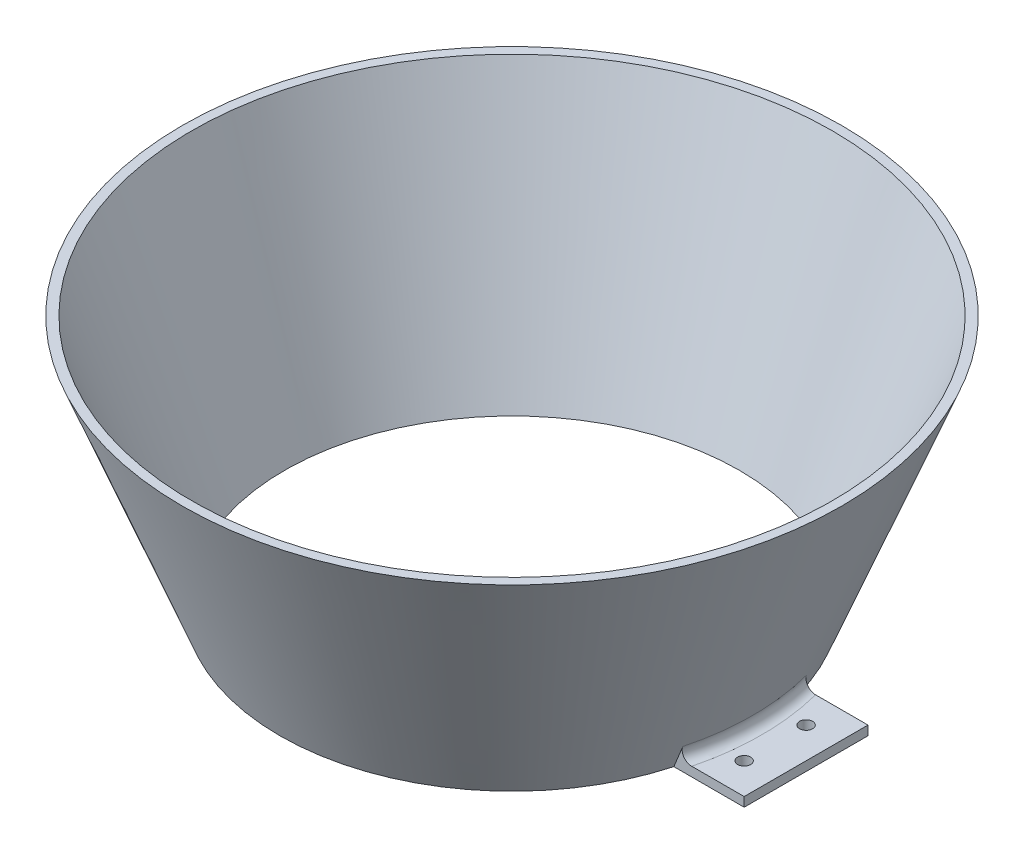
ISO-10303-21;
HEADER;
FILE_DESCRIPTION(('STEP AP214'),'2;1');
FILE_NAME('part.step','',(''),(''),'','','');
FILE_SCHEMA(('AUTOMOTIVE_DESIGN { 1 0 10303 214 1 1 1 1 }'));
ENDSEC;
DATA;
#1=APPLICATION_CONTEXT('core data for automotive mechanical design processes');
#2=APPLICATION_PROTOCOL_DEFINITION('international standard','automotive_design',2000,#1);
#3=PRODUCT_CONTEXT('',#1,'mechanical');
#4=PRODUCT('Part','Part','',(#3));
#5=PRODUCT_RELATED_PRODUCT_CATEGORY('part','',(#4));
#6=PRODUCT_DEFINITION_FORMATION('','',#4);
#7=PRODUCT_DEFINITION_CONTEXT('part definition',#1,'design');
#8=PRODUCT_DEFINITION('design','',#6,#7);
#9=PRODUCT_DEFINITION_SHAPE('','',#8);
#10=(LENGTH_UNIT() NAMED_UNIT(*) SI_UNIT(.MILLI.,.METRE.));
#11=(NAMED_UNIT(*) PLANE_ANGLE_UNIT() SI_UNIT($,.RADIAN.));
#12=(NAMED_UNIT(*) SI_UNIT($,.STERADIAN.) SOLID_ANGLE_UNIT());
#13=UNCERTAINTY_MEASURE_WITH_UNIT(LENGTH_MEASURE(1.E-05),#10,'distance_accuracy_value','');
#14=(GEOMETRIC_REPRESENTATION_CONTEXT(3) GLOBAL_UNCERTAINTY_ASSIGNED_CONTEXT((#13)) GLOBAL_UNIT_ASSIGNED_CONTEXT((#10,
#11,#12)) REPRESENTATION_CONTEXT('',''));
#15=CARTESIAN_POINT('',(0.,0.,0.));
#16=DIRECTION('',(0.,0.,1.));
#17=DIRECTION('',(1.,0.,0.));
#18=AXIS2_PLACEMENT_3D('',#15,#16,#17);
#19=CARTESIAN_POINT('',(0.,80.,0.));
#20=DIRECTION('',(0.,1.,0.));
#21=DIRECTION('',(0.,0.,1.));
#22=AXIS2_PLACEMENT_3D('',#19,#20,#21);
#23=CONICAL_SURFACE('',#22,103.5,0.358770670270572);
#24=CARTESIAN_POINT('',(0.,0.,0.));
#25=DIRECTION('',(0.,-1.,0.));
#26=DIRECTION('',(0.,0.,-1.));
#27=AXIS2_PLACEMENT_3D('',#24,#25,#26);
#28=CIRCLE('',#27,73.5);
#29=CARTESIAN_POINT('',(0.,0.,-73.5));
#30=VERTEX_POINT('',#29);
#31=EDGE_CURVE('E186',#30,#30,#28,.T.);
#32=ORIENTED_EDGE('',*,*,#31,.T.);
#33=EDGE_LOOP('',(#32));
#34=FACE_BOUND('',#33,.T.);
#35=CARTESIAN_POINT('',(0.,80.,0.));
#36=DIRECTION('',(0.,-1.,0.));
#37=DIRECTION('',(0.,0.,-1.));
#38=AXIS2_PLACEMENT_3D('',#35,#36,#37);
#39=CIRCLE('',#38,103.5);
#40=CARTESIAN_POINT('',(0.,80.,-103.5));
#41=VERTEX_POINT('',#40);
#42=EDGE_CURVE('E176',#41,#41,#39,.T.);
#43=ORIENTED_EDGE('',*,*,#42,.F.);
#44=EDGE_LOOP('',(#43));
#45=FACE_BOUND('',#44,.T.);
#46=ADVANCED_FACE('F39',(#34,#45),#23,.F.);
#47=CARTESIAN_POINT('',(73.5,0.,0.));
#48=DIRECTION('',(0.,-1.,0.));
#49=DIRECTION('',(0.,0.,-1.));
#50=AXIS2_PLACEMENT_3D('',#47,#48,#49);
#51=PLANE('',#50);
#52=CARTESIAN_POINT('',(-85.,0.,10.));
#53=DIRECTION('',(0.,-1.,0.));
#54=DIRECTION('',(0.,0.,1.));
#55=AXIS2_PLACEMENT_3D('',#52,#53,#54);
#56=CIRCLE('',#55,2.1);
#57=CARTESIAN_POINT('',(-85.,0.,12.1));
#58=VERTEX_POINT('',#57);
#59=EDGE_CURVE('E453',#58,#58,#56,.T.);
#60=ORIENTED_EDGE('',*,*,#59,.F.);
#61=EDGE_LOOP('',(#60));
#62=FACE_BOUND('',#61,.T.);
#63=CARTESIAN_POINT('',(-85.,0.,-10.));
#64=DIRECTION('',(0.,-1.,0.));
#65=DIRECTION('',(0.,0.,-1.));
#66=AXIS2_PLACEMENT_3D('',#63,#64,#65);
#67=CIRCLE('',#66,2.1);
#68=CARTESIAN_POINT('',(-85.,0.,-12.1));
#69=VERTEX_POINT('',#68);
#70=EDGE_CURVE('E446',#69,#69,#67,.T.);
#71=ORIENTED_EDGE('',*,*,#70,.F.);
#72=EDGE_LOOP('',(#71));
#73=FACE_BOUND('',#72,.T.);
#74=CARTESIAN_POINT('',(85.,0.,-10.));
#75=DIRECTION('',(0.,-1.,0.));
#76=DIRECTION('',(0.,0.,1.));
#77=AXIS2_PLACEMENT_3D('',#74,#75,#76);
#78=CIRCLE('',#77,2.1);
#79=CARTESIAN_POINT('',(85.,0.,-7.9));
#80=VERTEX_POINT('',#79);
#81=EDGE_CURVE('E451',#80,#80,#78,.T.);
#82=ORIENTED_EDGE('',*,*,#81,.F.);
#83=EDGE_LOOP('',(#82));
#84=FACE_BOUND('',#83,.T.);
#85=CARTESIAN_POINT('',(85.,0.,10.));
#86=DIRECTION('',(0.,-1.,0.));
#87=DIRECTION('',(0.,0.,-1.));
#88=AXIS2_PLACEMENT_3D('',#85,#86,#87);
#89=CIRCLE('',#88,2.1);
#90=CARTESIAN_POINT('',(85.,0.,7.9));
#91=VERTEX_POINT('',#90);
#92=EDGE_CURVE('E464',#91,#91,#89,.T.);
#93=ORIENTED_EDGE('',*,*,#92,.F.);
#94=EDGE_LOOP('',(#93));
#95=FACE_BOUND('',#94,.T.);
#96=CARTESIAN_POINT('',(0.,0.,0.));
#97=DIRECTION('',(0.,-1.,0.));
#98=DIRECTION('',(0.,0.,-1.));
#99=AXIS2_PLACEMENT_3D('',#96,#97,#98);
#100=CIRCLE('',#99,75.);
#101=CARTESIAN_POINT('',(72.2841614740048,0.,20.));
#102=VERTEX_POINT('',#101);
#103=CARTESIAN_POINT('',(-72.2841614740048,0.,20.));
#104=VERTEX_POINT('',#103);
#105=EDGE_CURVE('E184',#102,#104,#100,.T.);
#106=ORIENTED_EDGE('',*,*,#105,.T.);
#107=DIRECTION('',(-1.,0.,0.));
#108=VECTOR('',#107,1.);
#109=CARTESIAN_POINT('',(-95.,0.,20.));
#110=LINE('',#109,#108);
#111=CARTESIAN_POINT('',(-95.,0.,20.));
#112=VERTEX_POINT('',#111);
#113=EDGE_CURVE('E142',#104,#112,#110,.T.);
#114=ORIENTED_EDGE('',*,*,#113,.T.);
#115=DIRECTION('',(0.,0.,-1.));
#116=VECTOR('',#115,1.);
#117=CARTESIAN_POINT('',(-95.,0.,-20.));
#118=LINE('',#117,#116);
#119=CARTESIAN_POINT('',(-95.,0.,-20.));
#120=VERTEX_POINT('',#119);
#121=EDGE_CURVE('E125',#112,#120,#118,.T.);
#122=ORIENTED_EDGE('',*,*,#121,.T.);
#123=DIRECTION('',(1.,0.,0.));
#124=VECTOR('',#123,1.);
#125=CARTESIAN_POINT('',(-72.2841614740048,0.,-20.));
#126=LINE('',#125,#124);
#127=CARTESIAN_POINT('',(-72.2841614740048,0.,-20.));
#128=VERTEX_POINT('',#127);
#129=EDGE_CURVE('E140',#120,#128,#126,.T.);
#130=ORIENTED_EDGE('',*,*,#129,.T.);
#131=CARTESIAN_POINT('',(72.2841614740048,0.,-20.));
#132=VERTEX_POINT('',#131);
#133=EDGE_CURVE('E183',#128,#132,#100,.T.);
#134=ORIENTED_EDGE('',*,*,#133,.T.);
#135=DIRECTION('',(1.,0.,0.));
#136=VECTOR('',#135,1.);
#137=CARTESIAN_POINT('',(72.2841614740048,0.,-20.));
#138=LINE('',#137,#136);
#139=CARTESIAN_POINT('',(95.,0.,-20.));
#140=VERTEX_POINT('',#139);
#141=EDGE_CURVE('E154',#132,#140,#138,.T.);
#142=ORIENTED_EDGE('',*,*,#141,.T.);
#143=DIRECTION('',(0.,0.,1.));
#144=VECTOR('',#143,1.);
#145=CARTESIAN_POINT('',(95.,0.,-20.));
#146=LINE('',#145,#144);
#147=CARTESIAN_POINT('',(95.,0.,20.));
#148=VERTEX_POINT('',#147);
#149=EDGE_CURVE('E170',#140,#148,#146,.T.);
#150=ORIENTED_EDGE('',*,*,#149,.T.);
#151=DIRECTION('',(-1.,0.,0.));
#152=VECTOR('',#151,1.);
#153=CARTESIAN_POINT('',(95.,0.,20.));
#154=LINE('',#153,#152);
#155=EDGE_CURVE('E161',#148,#102,#154,.T.);
#156=ORIENTED_EDGE('',*,*,#155,.T.);
#157=EDGE_LOOP('',(#106,#114,#122,#130,#134,#142,#150,#156));
#158=FACE_BOUND('',#157,.T.);
#159=ORIENTED_EDGE('',*,*,#31,.F.);
#160=EDGE_LOOP('',(#159));
#161=FACE_BOUND('',#160,.T.);
#162=ADVANCED_FACE('F138',(#62,#73,#84,#95,#158,#161),#51,.T.);
#163=CARTESIAN_POINT('',(0.,0.,0.));
#164=DIRECTION('',(0.,1.,0.));
#165=DIRECTION('',(0.,0.,1.));
#166=AXIS2_PLACEMENT_3D('',#163,#164,#165);
#167=CONICAL_SURFACE('',#166,75.,0.375106861552295);
#168=CARTESIAN_POINT('',(0.,7.09911588745038,0.));
#169=DIRECTION('',(0.,-1.,0.));
#170=DIRECTION('',(0.,0.,-1.));
#171=AXIS2_PLACEMENT_3D('',#168,#169,#170);
#172=CIRCLE('',#171,77.7952768806836);
#173=CARTESIAN_POINT('',(-75.1804835375659,7.09911588745036,-20.));
#174=VERTEX_POINT('',#173);
#175=CARTESIAN_POINT('',(-75.1804835375659,7.09911588745036,20.));
#176=VERTEX_POINT('',#175);
#177=EDGE_CURVE('E280',#174,#176,#172,.F.);
#178=ORIENTED_EDGE('',*,*,#177,.T.);
#179=CARTESIAN_POINT('',(-62.8735450279451,-22.9132818516211,20.));
#180=CARTESIAN_POINT('',(-63.7127937488367,-20.8821258643666,20.));
#181=CARTESIAN_POINT('',(-64.5507361640538,-18.8504306317642,20.));
#182=CARTESIAN_POINT('',(-66.2242674418764,-14.7860717428361,20.));
#183=CARTESIAN_POINT('',(-67.0598563052033,-12.7534080868076,20.));
#184=CARTESIAN_POINT('',(-69.5634793697815,-6.65413394214606,20.));
#185=CARTESIAN_POINT('',(-71.228372614355,-2.58623405557579,20.));
#186=CARTESIAN_POINT('',(-74.5513638136694,5.5523088191067,20.));
#187=CARTESIAN_POINT('',(-76.209461811409,9.62295178967102,20.));
#188=CARTESIAN_POINT('',(-79.5200722531943,17.7665099716478,20.));
#189=CARTESIAN_POINT('',(-81.1725846948848,21.8394251840176,20.));
#190=CARTESIAN_POINT('',(-84.7737062468235,30.7295965504295,20.));
#191=CARTESIAN_POINT('',(-86.7213908472741,35.5472271341166,20.));
#192=CARTESIAN_POINT('',(-90.6114551957085,45.18462992649,20.));
#193=CARTESIAN_POINT('',(-92.5538349428574,50.0044021355132,20.));
#194=CARTESIAN_POINT('',(-96.4342022893878,59.6457183305952,20.));
#195=CARTESIAN_POINT('',(-98.3721898853822,64.4672623180169,20.));
#196=CARTESIAN_POINT('',(-102.24448587917,74.1118275404236,20.));
#197=CARTESIAN_POINT('',(-104.178794276805,78.9348487754721,20.));
#198=CARTESIAN_POINT('',(-108.044328911286,88.5822141473155,20.));
#199=CARTESIAN_POINT('',(-109.975555099171,93.4065583037264,20.));
#200=CARTESIAN_POINT('',(-113.835349673903,103.056309829621,20.));
#201=CARTESIAN_POINT('',(-115.763918060654,107.881717199143,20.));
#202=CARTESIAN_POINT('',(-119.618765536104,117.53343212351,20.));
#203=CARTESIAN_POINT('',(-121.545044630549,122.35973967606,20.));
#204=CARTESIAN_POINT('',(-125.395611655524,132.01314841354,20.));
#205=CARTESIAN_POINT('',(-127.319899586278,136.84024959838,20.));
#206=CARTESIAN_POINT('',(-129.243338789873,141.667688800755,20.));
#207=B_SPLINE_CURVE_WITH_KNOTS('',3,(#179,#180,#181,#182,#183,#184,#185,#186,#187,#188,#189,
#190,#191,#192,#193,#194,#195,#196,#197,#198,#199,#200,#201,#202,#203,#204,#205,#206),
.UNSPECIFIED.,.F.,.F.,(4,2,2,2,2,2,2,2,2,2,2,2,2,4),(0.,6.5931314189348,13.1862608168279,
26.3724994202548,39.5586544554173,52.7448150502635,68.3341458185368,83.9234790406863,
99.5128242811076,115.102170191536,130.691761323693,146.28135302736,161.870905528909,
177.46045627589),.UNSPECIFIED.);
#208=EDGE_CURVE('E273',#104,#176,#207,.T.);
#209=ORIENTED_EDGE('',*,*,#208,.F.);
#210=ORIENTED_EDGE('',*,*,#105,.F.);
#211=CARTESIAN_POINT('',(129.243338789873,141.667688800755,20.));
#212=CARTESIAN_POINT('',(127.319899586278,136.84024959838,20.));
#213=CARTESIAN_POINT('',(125.395611655524,132.01314841354,20.));
#214=CARTESIAN_POINT('',(121.545044630549,122.35973967606,20.));
#215=CARTESIAN_POINT('',(119.618765536104,117.53343212351,20.));
#216=CARTESIAN_POINT('',(115.763918060654,107.881717199143,20.));
#217=CARTESIAN_POINT('',(113.835349673903,103.056309829621,20.));
#218=CARTESIAN_POINT('',(109.975555099171,93.4065583037264,20.));
#219=CARTESIAN_POINT('',(108.044328911286,88.5822141473156,20.));
#220=CARTESIAN_POINT('',(104.178794276805,78.9348487754722,20.));
#221=CARTESIAN_POINT('',(102.24448587917,74.1118275404237,20.));
#222=CARTESIAN_POINT('',(98.3721898853822,64.4672623180169,20.));
#223=CARTESIAN_POINT('',(96.4342022893879,59.6457183305952,20.));
#224=CARTESIAN_POINT('',(92.5538349428574,50.0044021355133,20.));
#225=CARTESIAN_POINT('',(90.6114551957085,45.18462992649,20.));
#226=CARTESIAN_POINT('',(86.7213908472741,35.5472271341166,20.));
#227=CARTESIAN_POINT('',(84.7737062468235,30.7295965504295,20.));
#228=CARTESIAN_POINT('',(81.1725846948848,21.8394251840176,20.));
#229=CARTESIAN_POINT('',(79.5200722531943,17.7665099716478,20.));
#230=CARTESIAN_POINT('',(76.209461811409,9.62295178967102,20.));
#231=CARTESIAN_POINT('',(74.5513638136694,5.55230881910669,20.));
#232=CARTESIAN_POINT('',(71.228372614355,-2.58623405557579,20.));
#233=CARTESIAN_POINT('',(69.5634793697815,-6.65413394214606,20.));
#234=CARTESIAN_POINT('',(67.0598563052033,-12.7534080868076,20.));
#235=CARTESIAN_POINT('',(66.2242674418763,-14.7860717428361,20.));
#236=CARTESIAN_POINT('',(64.5507361640538,-18.8504306317642,20.));
#237=CARTESIAN_POINT('',(63.7127937488367,-20.8821258643667,20.));
#238=CARTESIAN_POINT('',(62.8735450279451,-22.9132818516211,20.));
#239=B_SPLINE_CURVE_WITH_KNOTS('',3,(#211,#212,#213,#214,#215,#216,#217,#218,#219,#220,#221,
#222,#223,#224,#225,#226,#227,#228,#229,#230,#231,#232,#233,#234,#235,#236,#237,#238),
.UNSPECIFIED.,.F.,.F.,(4,2,2,2,2,2,2,2,2,2,2,2,2,4),(0.,15.589550746982,31.1791032485302,
46.7686949521976,62.358286084354,77.9476319947828,93.5369772352041,109.126310457354,
124.715641225627,137.901801820473,151.087956855636,164.274195459063,170.867324856956,
177.46045627589),.UNSPECIFIED.);
#240=CARTESIAN_POINT('',(75.1804835375659,7.09911588745036,20.));
#241=VERTEX_POINT('',#240);
#242=EDGE_CURVE('E196',#241,#102,#239,.T.);
#243=ORIENTED_EDGE('',*,*,#242,.F.);
#244=CARTESIAN_POINT('',(0.,7.09911588745036,0.));
#245=DIRECTION('',(0.,1.,0.));
#246=DIRECTION('',(0.,0.,1.));
#247=AXIS2_PLACEMENT_3D('',#244,#245,#246);
#248=CIRCLE('',#247,77.7952768806836);
#249=CARTESIAN_POINT('',(75.1804835375659,7.09911588745036,-20.));
#250=VERTEX_POINT('',#249);
#251=EDGE_CURVE('E272',#241,#250,#248,.T.);
#252=ORIENTED_EDGE('',*,*,#251,.T.);
#253=CARTESIAN_POINT('',(62.8735450279451,-22.9132818516211,-20.));
#254=CARTESIAN_POINT('',(63.7127937488367,-20.8821258643666,-20.));
#255=CARTESIAN_POINT('',(64.5507361640538,-18.8504306317642,-20.));
#256=CARTESIAN_POINT('',(66.2242674418764,-14.7860717428361,-20.));
#257=CARTESIAN_POINT('',(67.0598563052033,-12.7534080868076,-20.));
#258=CARTESIAN_POINT('',(69.5634793697815,-6.65413394214605,-20.));
#259=CARTESIAN_POINT('',(71.228372614355,-2.58623405557578,-20.));
#260=CARTESIAN_POINT('',(74.5513638136694,5.5523088191067,-20.));
#261=CARTESIAN_POINT('',(76.209461811409,9.62295178967102,-20.));
#262=CARTESIAN_POINT('',(79.5200722531943,17.7665099716478,-20.));
#263=CARTESIAN_POINT('',(81.1725846948848,21.8394251840176,-20.));
#264=CARTESIAN_POINT('',(84.7737062468235,30.7295965504295,-20.));
#265=CARTESIAN_POINT('',(86.7213908472741,35.5472271341166,-20.));
#266=CARTESIAN_POINT('',(90.6114551957085,45.18462992649,-20.));
#267=CARTESIAN_POINT('',(92.5538349428574,50.0044021355133,-20.));
#268=CARTESIAN_POINT('',(96.4342022893879,59.6457183305952,-20.));
#269=CARTESIAN_POINT('',(98.3721898853822,64.4672623180169,-20.));
#270=CARTESIAN_POINT('',(102.24448587917,74.1118275404237,-20.));
#271=CARTESIAN_POINT('',(104.178794276805,78.9348487754722,-20.));
#272=CARTESIAN_POINT('',(108.044328911286,88.5822141473156,-20.));
#273=CARTESIAN_POINT('',(109.975555099171,93.4065583037264,-20.));
#274=CARTESIAN_POINT('',(113.835349673903,103.056309829621,-20.));
#275=CARTESIAN_POINT('',(115.763918060654,107.881717199143,-20.));
#276=CARTESIAN_POINT('',(119.618765536104,117.53343212351,-20.));
#277=CARTESIAN_POINT('',(121.545044630549,122.35973967606,-20.));
#278=CARTESIAN_POINT('',(125.395611655524,132.01314841354,-20.));
#279=CARTESIAN_POINT('',(127.319899586278,136.84024959838,-20.));
#280=CARTESIAN_POINT('',(129.243338789873,141.667688800755,-20.));
#281=B_SPLINE_CURVE_WITH_KNOTS('',3,(#253,#254,#255,#256,#257,#258,#259,#260,#261,#262,#263,
#264,#265,#266,#267,#268,#269,#270,#271,#272,#273,#274,#275,#276,#277,#278,#279,#280),
.UNSPECIFIED.,.F.,.F.,(4,2,2,2,2,2,2,2,2,2,2,2,2,4),(0.,6.5931314189348,13.1862608168279,
26.3724994202548,39.5586544554173,52.7448150502635,68.3341458185368,83.9234790406863,
99.5128242811077,115.102170191537,130.691761323693,146.28135302736,161.870905528909,
177.460456275891),.UNSPECIFIED.);
#282=EDGE_CURVE('E189',#132,#250,#281,.T.);
#283=ORIENTED_EDGE('',*,*,#282,.F.);
#284=ORIENTED_EDGE('',*,*,#133,.F.);
#285=CARTESIAN_POINT('',(-129.243338789873,141.667688800755,-20.));
#286=CARTESIAN_POINT('',(-127.319899586278,136.84024959838,-20.));
#287=CARTESIAN_POINT('',(-125.395611655524,132.01314841354,-20.));
#288=CARTESIAN_POINT('',(-121.545044630549,122.35973967606,-20.));
#289=CARTESIAN_POINT('',(-119.618765536104,117.53343212351,-20.));
#290=CARTESIAN_POINT('',(-115.763918060654,107.881717199143,-20.));
#291=CARTESIAN_POINT('',(-113.835349673903,103.056309829621,-20.));
#292=CARTESIAN_POINT('',(-109.975555099171,93.4065583037264,-20.));
#293=CARTESIAN_POINT('',(-108.044328911286,88.5822141473156,-20.));
#294=CARTESIAN_POINT('',(-104.178794276805,78.9348487754722,-20.));
#295=CARTESIAN_POINT('',(-102.24448587917,74.1118275404237,-20.));
#296=CARTESIAN_POINT('',(-98.3721898853822,64.4672623180169,-20.));
#297=CARTESIAN_POINT('',(-96.4342022893879,59.6457183305952,-20.));
#298=CARTESIAN_POINT('',(-92.5538349428574,50.0044021355133,-20.));
#299=CARTESIAN_POINT('',(-90.6114551957085,45.18462992649,-20.));
#300=CARTESIAN_POINT('',(-86.7213908472741,35.5472271341166,-20.));
#301=CARTESIAN_POINT('',(-84.7737062468235,30.7295965504295,-20.));
#302=CARTESIAN_POINT('',(-81.1725846948848,21.8394251840176,-20.));
#303=CARTESIAN_POINT('',(-79.5200722531943,17.7665099716478,-20.));
#304=CARTESIAN_POINT('',(-76.209461811409,9.62295178967102,-20.));
#305=CARTESIAN_POINT('',(-74.5513638136694,5.5523088191067,-20.));
#306=CARTESIAN_POINT('',(-71.228372614355,-2.58623405557578,-20.));
#307=CARTESIAN_POINT('',(-69.5634793697815,-6.65413394214604,-20.));
#308=CARTESIAN_POINT('',(-67.0598563052033,-12.7534080868076,-20.));
#309=CARTESIAN_POINT('',(-66.2242674418764,-14.7860717428361,-20.));
#310=CARTESIAN_POINT('',(-64.5507361640538,-18.8504306317641,-20.));
#311=CARTESIAN_POINT('',(-63.7127937488367,-20.8821258643666,-20.));
#312=CARTESIAN_POINT('',(-62.8735450279451,-22.9132818516211,-20.));
#313=B_SPLINE_CURVE_WITH_KNOTS('',3,(#285,#286,#287,#288,#289,#290,#291,#292,#293,#294,#295,
#296,#297,#298,#299,#300,#301,#302,#303,#304,#305,#306,#307,#308,#309,#310,#311,#312),
.UNSPECIFIED.,.F.,.F.,(4,2,2,2,2,2,2,2,2,2,2,2,2,4),(0.,15.589550746982,31.1791032485302,
46.7686949521976,62.358286084354,77.9476319947828,93.5369772352041,109.126310457354,
124.715641225627,137.901801820473,151.087956855636,164.274195459063,170.867324856956,
177.46045627589),.UNSPECIFIED.);
#314=EDGE_CURVE('E146',#174,#128,#313,.T.);
#315=ORIENTED_EDGE('',*,*,#314,.F.);
#316=EDGE_LOOP('',(#178,#209,#210,#243,#252,#283,#284,#315));
#317=FACE_BOUND('',#316,.T.);
#318=CARTESIAN_POINT('',(0.,80.,0.));
#319=DIRECTION('',(0.,-1.,0.));
#320=DIRECTION('',(0.,0.,-1.));
#321=AXIS2_PLACEMENT_3D('',#318,#319,#320);
#322=CIRCLE('',#321,106.5);
#323=CARTESIAN_POINT('',(0.,80.,-106.5));
#324=VERTEX_POINT('',#323);
#325=EDGE_CURVE('E180',#324,#324,#322,.T.);
#326=ORIENTED_EDGE('',*,*,#325,.T.);
#327=EDGE_LOOP('',(#326));
#328=FACE_BOUND('',#327,.T.);
#329=ADVANCED_FACE('F203',(#317,#328),#167,.T.);
#330=CARTESIAN_POINT('',(106.5,80.,0.));
#331=DIRECTION('',(0.,1.,0.));
#332=DIRECTION('',(0.,0.,1.));
#333=AXIS2_PLACEMENT_3D('',#330,#331,#332);
#334=PLANE('',#333);
#335=ORIENTED_EDGE('',*,*,#42,.T.);
#336=EDGE_LOOP('',(#335));
#337=FACE_BOUND('',#336,.T.);
#338=ORIENTED_EDGE('',*,*,#325,.F.);
#339=EDGE_LOOP('',(#338));
#340=FACE_BOUND('',#339,.T.);
#341=ADVANCED_FACE('F213',(#337,#340),#334,.T.);
#342=CARTESIAN_POINT('',(95.,3.,20.));
#343=DIRECTION('',(0.,0.,1.));
#344=DIRECTION('',(1.,0.,0.));
#345=AXIS2_PLACEMENT_3D('',#342,#343,#344);
#346=PLANE('',#345);
#347=DIRECTION('',(-1.,0.,0.));
#348=VECTOR('',#347,1.);
#349=CARTESIAN_POINT('',(95.,3.,20.));
#350=LINE('',#349,#348);
#351=CARTESIAN_POINT('',(95.,3.,20.));
#352=VERTEX_POINT('',#351);
#353=CARTESIAN_POINT('',(78.0654428386368,3.,20.));
#354=VERTEX_POINT('',#353);
#355=EDGE_CURVE('E164',#352,#354,#350,.T.);
#356=ORIENTED_EDGE('',*,*,#355,.T.);
#357=CARTESIAN_POINT('',(78.0654428386368,3.,20.));
#358=CARTESIAN_POINT('',(77.9761012386683,2.99999347030844,20.));
#359=CARTESIAN_POINT('',(77.886763153462,3.00374520553447,20.));
#360=CARTESIAN_POINT('',(77.7087134274104,3.0187092604427,20.));
#361=CARTESIAN_POINT('',(77.6200017902027,3.02992162341219,20.));
#362=CARTESIAN_POINT('',(77.4438050319626,3.05975444024869,20.));
#363=CARTESIAN_POINT('',(77.3563201996479,3.0783766086342,20.));
#364=CARTESIAN_POINT('',(77.183250036864,3.1229000078618,20.));
#365=CARTESIAN_POINT('',(77.0976646660982,3.14880108412487,20.));
#366=CARTESIAN_POINT('',(76.8445493320267,3.23727241354867,20.));
#367=CARTESIAN_POINT('',(76.6806328213007,3.31061540077262,20.));
#368=CARTESIAN_POINT('',(76.3678349350593,3.48410273215398,20.));
#369=CARTESIAN_POINT('',(76.2189468071021,3.58423496507224,20.));
#370=CARTESIAN_POINT('',(75.9426914003036,3.80716593911034,20.));
#371=CARTESIAN_POINT('',(75.8150468974244,3.92962018843021,20.));
#372=CARTESIAN_POINT('',(75.5829264899209,4.19486218972995,20.));
#373=CARTESIAN_POINT('',(75.4784515715908,4.33765080688836,20.));
#374=CARTESIAN_POINT('',(75.2992280542332,4.63465559468522,20.));
#375=CARTESIAN_POINT('',(75.2236434198663,4.78836717954048,20.));
#376=CARTESIAN_POINT('',(75.1002903316155,5.10655715571421,20.));
#377=CARTESIAN_POINT('',(75.0525134368709,5.27103226295336,20.));
#378=CARTESIAN_POINT('',(74.9874830370016,5.60073268272364,20.));
#379=CARTESIAN_POINT('',(74.9693524731073,5.76578578438204,20.));
#380=CARTESIAN_POINT('',(74.961508802983,6.09656640303424,20.));
#381=CARTESIAN_POINT('',(74.9717858660002,6.26229366690742,20.));
#382=CARTESIAN_POINT('',(75.0131867786179,6.54131608863272,20.));
#383=CARTESIAN_POINT('',(75.0372948225047,6.65570392384745,20.));
#384=CARTESIAN_POINT('',(75.0989466726731,6.880629411031,20.));
#385=CARTESIAN_POINT('',(75.1364717385033,6.99117219849668,20.));
#386=CARTESIAN_POINT('',(75.1804835375659,7.09911588745036,20.));
#387=B_SPLINE_CURVE_WITH_KNOTS('',3,(#357,#358,#359,#360,#361,#362,#363,#364,#365,#366,#367,
#368,#369,#370,#371,#372,#373,#374,#375,#376,#377,#378,#379,#380,#381,#382,#383,#384,#385,#386),
.UNSPECIFIED.,.F.,.F.,(4,2,2,2,2,2,2,2,2,2,2,2,2,2,4),(0.,0.267939614693496,0.535880784011999,
0.803883987008252,1.07188149896669,1.60779442410802,2.14346547481421,2.67147884889802,
3.19951469539922,3.71084158363977,4.22201318083068,4.71776909229854,5.21335346378917,
5.56326289754038,5.91268548651998),.UNSPECIFIED.);
#388=EDGE_CURVE('E53',#354,#241,#387,.T.);
#389=ORIENTED_EDGE('',*,*,#388,.T.);
#390=ORIENTED_EDGE('',*,*,#242,.T.);
#391=ORIENTED_EDGE('',*,*,#155,.F.);
#392=DIRECTION('',(0.,-1.,0.));
#393=VECTOR('',#392,1.);
#394=CARTESIAN_POINT('',(95.,3.,20.));
#395=LINE('',#394,#393);
#396=EDGE_CURVE('E174',#352,#148,#395,.T.);
#397=ORIENTED_EDGE('',*,*,#396,.F.);
#398=EDGE_LOOP('',(#356,#389,#390,#391,#397));
#399=FACE_BOUND('',#398,.T.);
#400=ADVANCED_FACE('F216',(#399),#346,.T.);
#401=CARTESIAN_POINT('',(95.,3.,-20.));
#402=DIRECTION('',(1.,0.,0.));
#403=DIRECTION('',(0.,0.,-1.));
#404=AXIS2_PLACEMENT_3D('',#401,#402,#403);
#405=PLANE('',#404);
#406=ORIENTED_EDGE('',*,*,#149,.F.);
#407=DIRECTION('',(0.,-1.,0.));
#408=VECTOR('',#407,1.);
#409=CARTESIAN_POINT('',(95.,3.,-20.));
#410=LINE('',#409,#408);
#411=CARTESIAN_POINT('',(95.,3.,-20.));
#412=VERTEX_POINT('',#411);
#413=EDGE_CURVE('E167',#412,#140,#410,.T.);
#414=ORIENTED_EDGE('',*,*,#413,.F.);
#415=DIRECTION('',(0.,0.,1.));
#416=VECTOR('',#415,1.);
#417=CARTESIAN_POINT('',(95.,3.,-20.));
#418=LINE('',#417,#416);
#419=EDGE_CURVE('E160',#412,#352,#418,.T.);
#420=ORIENTED_EDGE('',*,*,#419,.T.);
#421=ORIENTED_EDGE('',*,*,#396,.T.);
#422=EDGE_LOOP('',(#406,#414,#420,#421));
#423=FACE_BOUND('',#422,.T.);
#424=ADVANCED_FACE('F212',(#423),#405,.T.);
#425=CARTESIAN_POINT('',(72.2841614740048,3.,-20.));
#426=DIRECTION('',(0.,0.,-1.));
#427=DIRECTION('',(-1.,0.,0.));
#428=AXIS2_PLACEMENT_3D('',#425,#426,#427);
#429=PLANE('',#428);
#430=ORIENTED_EDGE('',*,*,#141,.F.);
#431=ORIENTED_EDGE('',*,*,#282,.T.);
#432=CARTESIAN_POINT('',(75.1804835375663,7.09911588745036,-19.9999999999984));
#433=CARTESIAN_POINT('',(75.1495970572238,7.02333485562118,-19.9999999999994));
#434=CARTESIAN_POINT('',(75.1218902370485,6.94625900014511,-19.9999999999998));
#435=CARTESIAN_POINT('',(75.0730258938694,6.79005749324272,-20.0000000000002));
#436=CARTESIAN_POINT('',(75.0518684687245,6.71093181120767,-20.));
#437=CARTESIAN_POINT('',(75.0163068445998,6.551231259978,-20.));
#438=CARTESIAN_POINT('',(75.001897714535,6.47065749376701,-20.));
#439=CARTESIAN_POINT('',(74.979925732213,6.30860658092187,-20.));
#440=CARTESIAN_POINT('',(74.9723626478324,6.22712946501171,-20.));
#441=CARTESIAN_POINT('',(74.9600681650108,5.98206739450542,-20.));
#442=CARTESIAN_POINT('',(74.9657274971395,5.81783353254825,-20.));
#443=CARTESIAN_POINT('',(75.0046214013036,5.4928098690478,-20.));
#444=CARTESIAN_POINT('',(75.0378478046238,5.3320190617303,-20.));
#445=CARTESIAN_POINT('',(75.130610431114,5.01859634018163,-20.));
#446=CARTESIAN_POINT('',(75.1900880214653,4.86594708841026,-20.));
#447=CARTESIAN_POINT('',(75.3334125281706,4.57252939705343,-20.));
#448=CARTESIAN_POINT('',(75.4172667385683,4.43176452984071,-20.));
#449=CARTESIAN_POINT('',(75.6083926904071,4.16341681776147,-20.));
#450=CARTESIAN_POINT('',(75.7160486548013,4.03610785285801,-20.));
#451=CARTESIAN_POINT('',(75.9506056404561,3.80072244375759,-20.));
#452=CARTESIAN_POINT('',(76.077505986075,3.69264532464841,-20.));
#453=CARTESIAN_POINT('',(76.3511304201148,3.49520141212601,-20.));
#454=CARTESIAN_POINT('',(76.4983455023497,3.40651512612283,-20.));
#455=CARTESIAN_POINT('',(76.8052597643911,3.25425824126292,-20.));
#456=CARTESIAN_POINT('',(76.9649627444286,3.1906953236859,-20.));
#457=CARTESIAN_POINT('',(77.2802989737515,3.09387919081888,-20.));
#458=CARTESIAN_POINT('',(77.4353450984881,3.05871655235393,-20.));
#459=CARTESIAN_POINT('',(77.670363197749,3.02351279906429,-20.));
#460=CARTESIAN_POINT('',(77.7491089050742,3.01470158298482,-20.));
#461=CARTESIAN_POINT('',(77.9070413123571,3.00294541212018,-20.));
#462=CARTESIAN_POINT('',(77.9862280355437,3.00000076932131,-20.));
#463=CARTESIAN_POINT('',(78.0654428386369,3.,-20.));
#464=B_SPLINE_CURVE_WITH_KNOTS('',3,(#432,#433,#434,#435,#436,#437,#438,#439,#440,#441,#442,
#443,#444,#445,#446,#447,#448,#449,#450,#451,#452,#453,#454,#455,#456,#457,#458,#459,#460,#461,
#462,#463),.UNSPECIFIED.,.F.,.F.,(4,2,2,2,2,2,2,2,2,2,2,2,2,2,2,4),(0.,0.245426895495709,
0.490857457907748,0.736108399464902,0.981351025181621,1.47178110226978,1.96206590627613,
2.45126114270006,2.94060290849435,3.43851046095951,3.93640053667318,4.44965904356268,
4.96307435419255,5.43813815250438,5.67565929338731,5.91319306538632),.UNSPECIFIED.);
#465=CARTESIAN_POINT('',(78.0654428386369,3.,-20.));
#466=VERTEX_POINT('',#465);
#467=EDGE_CURVE('E11',#250,#466,#464,.T.);
#468=ORIENTED_EDGE('',*,*,#467,.T.);
#469=DIRECTION('',(1.,0.,0.));
#470=VECTOR('',#469,1.);
#471=CARTESIAN_POINT('',(72.2841614740048,3.,-20.));
#472=LINE('',#471,#470);
#473=EDGE_CURVE('E158',#466,#412,#472,.T.);
#474=ORIENTED_EDGE('',*,*,#473,.T.);
#475=ORIENTED_EDGE('',*,*,#413,.T.);
#476=EDGE_LOOP('',(#430,#431,#468,#474,#475));
#477=FACE_BOUND('',#476,.T.);
#478=ADVANCED_FACE('F207',(#477),#429,.T.);
#479=CARTESIAN_POINT('',(0.,3.,0.));
#480=DIRECTION('',(0.,1.,0.));
#481=DIRECTION('',(0.,0.,1.));
#482=AXIS2_PLACEMENT_3D('',#479,#480,#481);
#483=PLANE('',#482);
#484=CARTESIAN_POINT('',(85.,3.,-10.));
#485=DIRECTION('',(0.,-1.,0.));
#486=DIRECTION('',(0.,0.,1.));
#487=AXIS2_PLACEMENT_3D('',#484,#485,#486);
#488=CIRCLE('',#487,2.1);
#489=CARTESIAN_POINT('',(85.,3.,-7.9));
#490=VERTEX_POINT('',#489);
#491=EDGE_CURVE('E448',#490,#490,#488,.T.);
#492=ORIENTED_EDGE('',*,*,#491,.T.);
#493=EDGE_LOOP('',(#492));
#494=FACE_BOUND('',#493,.T.);
#495=CARTESIAN_POINT('',(85.,3.,10.));
#496=DIRECTION('',(0.,-1.,0.));
#497=DIRECTION('',(0.,0.,-1.));
#498=AXIS2_PLACEMENT_3D('',#495,#496,#497);
#499=CIRCLE('',#498,2.1);
#500=CARTESIAN_POINT('',(85.,3.,7.9));
#501=VERTEX_POINT('',#500);
#502=EDGE_CURVE('E134',#501,#501,#499,.T.);
#503=ORIENTED_EDGE('',*,*,#502,.T.);
#504=EDGE_LOOP('',(#503));
#505=FACE_BOUND('',#504,.T.);
#506=ORIENTED_EDGE('',*,*,#473,.F.);
#507=CARTESIAN_POINT('',(0.,3.,0.));
#508=DIRECTION('',(0.,1.,0.));
#509=DIRECTION('',(0.,0.,1.));
#510=AXIS2_PLACEMENT_3D('',#507,#508,#509);
#511=CIRCLE('',#510,80.5866823091289);
#512=EDGE_CURVE('E284',#466,#354,#511,.F.);
#513=ORIENTED_EDGE('',*,*,#512,.T.);
#514=ORIENTED_EDGE('',*,*,#355,.F.);
#515=ORIENTED_EDGE('',*,*,#419,.F.);
#516=EDGE_LOOP('',(#506,#513,#514,#515));
#517=FACE_BOUND('',#516,.T.);
#518=ADVANCED_FACE('F211',(#494,#505,#517),#483,.T.);
#519=CARTESIAN_POINT('',(-72.2841614740048,3.,-20.));
#520=DIRECTION('',(0.,0.,-1.));
#521=DIRECTION('',(-1.,0.,0.));
#522=AXIS2_PLACEMENT_3D('',#519,#520,#521);
#523=PLANE('',#522);
#524=DIRECTION('',(1.,0.,0.));
#525=VECTOR('',#524,1.);
#526=CARTESIAN_POINT('',(-72.2841614740048,3.,-20.));
#527=LINE('',#526,#525);
#528=CARTESIAN_POINT('',(-95.,3.,-20.));
#529=VERTEX_POINT('',#528);
#530=CARTESIAN_POINT('',(-78.0654428386369,3.,-20.));
#531=VERTEX_POINT('',#530);
#532=EDGE_CURVE('E155',#529,#531,#527,.T.);
#533=ORIENTED_EDGE('',*,*,#532,.T.);
#534=CARTESIAN_POINT('',(-78.0654428386369,3.,-20.));
#535=CARTESIAN_POINT('',(-77.9761012386683,2.99999347030844,-20.));
#536=CARTESIAN_POINT('',(-77.886763153462,3.00374520553447,-20.));
#537=CARTESIAN_POINT('',(-77.7087134274104,3.0187092604427,-20.));
#538=CARTESIAN_POINT('',(-77.6200017902027,3.02992162341219,-20.));
#539=CARTESIAN_POINT('',(-77.4438050319626,3.05975444024869,-20.));
#540=CARTESIAN_POINT('',(-77.3563201996479,3.0783766086342,-20.));
#541=CARTESIAN_POINT('',(-77.183250036864,3.1229000078618,-20.));
#542=CARTESIAN_POINT('',(-77.0976646660982,3.14880108412487,-20.));
#543=CARTESIAN_POINT('',(-76.8445493320267,3.23727241354868,-20.));
#544=CARTESIAN_POINT('',(-76.6806328213007,3.31061540077262,-20.));
#545=CARTESIAN_POINT('',(-76.3678349350593,3.48410273215399,-20.));
#546=CARTESIAN_POINT('',(-76.2189468071021,3.58423496507226,-20.));
#547=CARTESIAN_POINT('',(-75.9426914003036,3.80716593911035,-20.));
#548=CARTESIAN_POINT('',(-75.8150468974244,3.92962018843022,-20.));
#549=CARTESIAN_POINT('',(-75.5829264899209,4.19486218972995,-20.));
#550=CARTESIAN_POINT('',(-75.4784515715908,4.33765080688836,-20.));
#551=CARTESIAN_POINT('',(-75.2992280542332,4.63465559468522,-20.));
#552=CARTESIAN_POINT('',(-75.2236434198663,4.78836717954049,-20.));
#553=CARTESIAN_POINT('',(-75.1002903316155,5.10655715571422,-20.));
#554=CARTESIAN_POINT('',(-75.0525134368709,5.27103226295336,-20.));
#555=CARTESIAN_POINT('',(-74.9874830370016,5.60073268272365,-20.));
#556=CARTESIAN_POINT('',(-74.9693524731073,5.76578578438205,-20.));
#557=CARTESIAN_POINT('',(-74.961508802983,6.09656640303425,-20.));
#558=CARTESIAN_POINT('',(-74.9717858660002,6.26229366690743,-20.));
#559=CARTESIAN_POINT('',(-75.0131867786179,6.54131608863272,-20.));
#560=CARTESIAN_POINT('',(-75.0372948225047,6.65570392384746,-20.));
#561=CARTESIAN_POINT('',(-75.0989466726731,6.880629411031,-20.));
#562=CARTESIAN_POINT('',(-75.1364717385033,6.99117219849668,-20.));
#563=CARTESIAN_POINT('',(-75.1804835375659,7.09911588745036,-20.));
#564=B_SPLINE_CURVE_WITH_KNOTS('',3,(#534,#535,#536,#537,#538,#539,#540,#541,#542,#543,#544,
#545,#546,#547,#548,#549,#550,#551,#552,#553,#554,#555,#556,#557,#558,#559,#560,#561,#562,#563),
.UNSPECIFIED.,.F.,.F.,(4,2,2,2,2,2,2,2,2,2,2,2,2,2,4),(0.,0.267939614693509,0.535880784012013,
0.803883987008266,1.0718814989667,1.60779442410805,2.14346547481425,2.67147884889805,
3.19951469539923,3.71084158363979,4.2220131808307,4.71776909229856,5.21335346378919,
5.5632628975404,5.91268548652),.UNSPECIFIED.);
#565=EDGE_CURVE('E249',#531,#174,#564,.T.);
#566=ORIENTED_EDGE('',*,*,#565,.T.);
#567=ORIENTED_EDGE('',*,*,#314,.T.);
#568=ORIENTED_EDGE('',*,*,#129,.F.);
#569=DIRECTION('',(0.,-1.,0.));
#570=VECTOR('',#569,1.);
#571=CARTESIAN_POINT('',(-95.,3.,-20.));
#572=LINE('',#571,#570);
#573=EDGE_CURVE('E121',#529,#120,#572,.T.);
#574=ORIENTED_EDGE('',*,*,#573,.F.);
#575=EDGE_LOOP('',(#533,#566,#567,#568,#574));
#576=FACE_BOUND('',#575,.T.);
#577=ADVANCED_FACE('F144',(#576),#523,.T.);
#578=CARTESIAN_POINT('',(-95.,3.,-20.));
#579=DIRECTION('',(-1.,0.,0.));
#580=DIRECTION('',(0.,0.,1.));
#581=AXIS2_PLACEMENT_3D('',#578,#579,#580);
#582=PLANE('',#581);
#583=ORIENTED_EDGE('',*,*,#121,.F.);
#584=DIRECTION('',(0.,-1.,0.));
#585=VECTOR('',#584,1.);
#586=CARTESIAN_POINT('',(-95.,3.,20.));
#587=LINE('',#586,#585);
#588=CARTESIAN_POINT('',(-95.,3.,20.));
#589=VERTEX_POINT('',#588);
#590=EDGE_CURVE('E133',#589,#112,#587,.T.);
#591=ORIENTED_EDGE('',*,*,#590,.F.);
#592=DIRECTION('',(0.,0.,-1.));
#593=VECTOR('',#592,1.);
#594=CARTESIAN_POINT('',(-95.,3.,-20.));
#595=LINE('',#594,#593);
#596=EDGE_CURVE('E128',#589,#529,#595,.T.);
#597=ORIENTED_EDGE('',*,*,#596,.T.);
#598=ORIENTED_EDGE('',*,*,#573,.T.);
#599=EDGE_LOOP('',(#583,#591,#597,#598));
#600=FACE_BOUND('',#599,.T.);
#601=ADVANCED_FACE('F123',(#600),#582,.T.);
#602=CARTESIAN_POINT('',(-95.,3.,20.));
#603=DIRECTION('',(0.,0.,1.));
#604=DIRECTION('',(1.,0.,0.));
#605=AXIS2_PLACEMENT_3D('',#602,#603,#604);
#606=PLANE('',#605);
#607=ORIENTED_EDGE('',*,*,#113,.F.);
#608=ORIENTED_EDGE('',*,*,#208,.T.);
#609=CARTESIAN_POINT('',(-75.1804835375659,7.09911588745036,20.));
#610=CARTESIAN_POINT('',(-75.1495970572236,7.02333485562111,20.));
#611=CARTESIAN_POINT('',(-75.1218902370485,6.94625900014501,20.));
#612=CARTESIAN_POINT('',(-75.0730258938694,6.79005749324262,20.));
#613=CARTESIAN_POINT('',(-75.0518684687245,6.71093181120758,20.));
#614=CARTESIAN_POINT('',(-75.0163068445997,6.55123125997794,20.));
#615=CARTESIAN_POINT('',(-75.0018977145349,6.47065749376694,20.));
#616=CARTESIAN_POINT('',(-74.979925732213,6.30860658092181,20.));
#617=CARTESIAN_POINT('',(-74.9723626478324,6.22712946501165,20.));
#618=CARTESIAN_POINT('',(-74.9600681650108,5.98206739450538,20.));
#619=CARTESIAN_POINT('',(-74.9657274971395,5.81783353254822,20.));
#620=CARTESIAN_POINT('',(-75.0046214013036,5.49280986904781,20.));
#621=CARTESIAN_POINT('',(-75.0378478046238,5.33201906173033,20.));
#622=CARTESIAN_POINT('',(-75.130610431114,5.01859634018167,20.));
#623=CARTESIAN_POINT('',(-75.1900880214653,4.86594708841031,20.));
#624=CARTESIAN_POINT('',(-75.3334125281706,4.57252939705348,20.));
#625=CARTESIAN_POINT('',(-75.4172667385683,4.43176452984075,20.));
#626=CARTESIAN_POINT('',(-75.608392690407,4.1634168177615,20.));
#627=CARTESIAN_POINT('',(-75.7160486548012,4.03610785285804,20.));
#628=CARTESIAN_POINT('',(-75.9506056404561,3.80072244375762,20.));
#629=CARTESIAN_POINT('',(-76.077505986075,3.69264532464844,20.));
#630=CARTESIAN_POINT('',(-76.3511304201147,3.49520141212604,20.));
#631=CARTESIAN_POINT('',(-76.4983455023497,3.40651512612286,20.));
#632=CARTESIAN_POINT('',(-76.8052597643911,3.25425824126294,20.));
#633=CARTESIAN_POINT('',(-76.9649627444286,3.19069532368592,20.));
#634=CARTESIAN_POINT('',(-77.2802989737514,3.0938791908189,20.));
#635=CARTESIAN_POINT('',(-77.4353450984881,3.05871655235394,20.));
#636=CARTESIAN_POINT('',(-77.670363197749,3.02351279906429,20.));
#637=CARTESIAN_POINT('',(-77.7491089050741,3.01470158298483,20.));
#638=CARTESIAN_POINT('',(-77.9070413123571,3.00294541212018,20.));
#639=CARTESIAN_POINT('',(-77.9862280355437,3.00000076932131,20.));
#640=CARTESIAN_POINT('',(-78.0654428386368,3.,20.));
#641=B_SPLINE_CURVE_WITH_KNOTS('',3,(#609,#610,#611,#612,#613,#614,#615,#616,#617,#618,#619,
#620,#621,#622,#623,#624,#625,#626,#627,#628,#629,#630,#631,#632,#633,#634,#635,#636,#637,#638,
#639,#640),.UNSPECIFIED.,.F.,.F.,(4,2,2,2,2,2,2,2,2,2,2,2,2,2,2,4),(0.,0.245426895495666,
0.490857457907685,0.736108399464834,0.98135102518154,1.47178110226965,1.96206590627595,
2.45126114269988,2.94060290849416,3.43851046095932,3.93640053667299,4.44965904356249,
4.96307435419235,5.43813815250419,5.67565929338714,5.91319306538616),.UNSPECIFIED.);
#642=CARTESIAN_POINT('',(-78.0654428386368,3.,20.));
#643=VERTEX_POINT('',#642);
#644=EDGE_CURVE('E241',#176,#643,#641,.T.);
#645=ORIENTED_EDGE('',*,*,#644,.T.);
#646=DIRECTION('',(-1.,0.,0.));
#647=VECTOR('',#646,1.);
#648=CARTESIAN_POINT('',(-95.,3.,20.));
#649=LINE('',#648,#647);
#650=EDGE_CURVE('E148',#643,#589,#649,.T.);
#651=ORIENTED_EDGE('',*,*,#650,.T.);
#652=ORIENTED_EDGE('',*,*,#590,.T.);
#653=EDGE_LOOP('',(#607,#608,#645,#651,#652));
#654=FACE_BOUND('',#653,.T.);
#655=ADVANCED_FACE('F290',(#654),#606,.T.);
#656=CARTESIAN_POINT('',(0.,3.,0.));
#657=DIRECTION('',(0.,-1.,0.));
#658=DIRECTION('',(0.,0.,-1.));
#659=AXIS2_PLACEMENT_3D('',#656,#657,#658);
#660=PLANE('',#659);
#661=CARTESIAN_POINT('',(-85.,3.,10.));
#662=DIRECTION('',(0.,-1.,0.));
#663=DIRECTION('',(0.,0.,1.));
#664=AXIS2_PLACEMENT_3D('',#661,#662,#663);
#665=CIRCLE('',#664,2.1);
#666=CARTESIAN_POINT('',(-85.,3.,12.1));
#667=VERTEX_POINT('',#666);
#668=EDGE_CURVE('E459',#667,#667,#665,.T.);
#669=ORIENTED_EDGE('',*,*,#668,.T.);
#670=EDGE_LOOP('',(#669));
#671=FACE_BOUND('',#670,.T.);
#672=CARTESIAN_POINT('',(-85.,3.,-10.));
#673=DIRECTION('',(0.,-1.,0.));
#674=DIRECTION('',(0.,0.,-1.));
#675=AXIS2_PLACEMENT_3D('',#672,#673,#674);
#676=CIRCLE('',#675,2.1);
#677=CARTESIAN_POINT('',(-85.,3.,-12.1));
#678=VERTEX_POINT('',#677);
#679=EDGE_CURVE('E443',#678,#678,#676,.T.);
#680=ORIENTED_EDGE('',*,*,#679,.T.);
#681=EDGE_LOOP('',(#680));
#682=FACE_BOUND('',#681,.T.);
#683=ORIENTED_EDGE('',*,*,#650,.F.);
#684=CARTESIAN_POINT('',(0.,3.,0.));
#685=DIRECTION('',(0.,-1.,0.));
#686=DIRECTION('',(0.,0.,-1.));
#687=AXIS2_PLACEMENT_3D('',#684,#685,#686);
#688=CIRCLE('',#687,80.5866823091289);
#689=EDGE_CURVE('E283',#643,#531,#688,.T.);
#690=ORIENTED_EDGE('',*,*,#689,.T.);
#691=ORIENTED_EDGE('',*,*,#532,.F.);
#692=ORIENTED_EDGE('',*,*,#596,.F.);
#693=EDGE_LOOP('',(#683,#690,#691,#692));
#694=FACE_BOUND('',#693,.T.);
#695=ADVANCED_FACE('F263',(#671,#682,#694),#660,.F.);
#696=CARTESIAN_POINT('',(-85.,3.,-10.));
#697=DIRECTION('',(0.,-1.,0.));
#698=DIRECTION('',(0.,0.,-1.));
#699=AXIS2_PLACEMENT_3D('',#696,#697,#698);
#700=CYLINDRICAL_SURFACE('',#699,2.1);
#701=ORIENTED_EDGE('',*,*,#679,.F.);
#702=EDGE_LOOP('',(#701));
#703=FACE_BOUND('',#702,.T.);
#704=ORIENTED_EDGE('',*,*,#70,.T.);
#705=EDGE_LOOP('',(#704));
#706=FACE_BOUND('',#705,.T.);
#707=ADVANCED_FACE('F322',(#703,#706),#700,.F.);
#708=CARTESIAN_POINT('',(-85.,3.,10.));
#709=DIRECTION('',(0.,-1.,0.));
#710=DIRECTION('',(0.,0.,-1.));
#711=AXIS2_PLACEMENT_3D('',#708,#709,#710);
#712=CYLINDRICAL_SURFACE('',#711,2.1);
#713=ORIENTED_EDGE('',*,*,#668,.F.);
#714=EDGE_LOOP('',(#713));
#715=FACE_BOUND('',#714,.T.);
#716=ORIENTED_EDGE('',*,*,#59,.T.);
#717=EDGE_LOOP('',(#716));
#718=FACE_BOUND('',#717,.T.);
#719=ADVANCED_FACE('F376',(#715,#718),#712,.F.);
#720=CARTESIAN_POINT('',(85.,3.,10.));
#721=DIRECTION('',(0.,-1.,0.));
#722=DIRECTION('',(0.,0.,-1.));
#723=AXIS2_PLACEMENT_3D('',#720,#721,#722);
#724=CYLINDRICAL_SURFACE('',#723,2.1);
#725=ORIENTED_EDGE('',*,*,#502,.F.);
#726=EDGE_LOOP('',(#725));
#727=FACE_BOUND('',#726,.T.);
#728=ORIENTED_EDGE('',*,*,#92,.T.);
#729=EDGE_LOOP('',(#728));
#730=FACE_BOUND('',#729,.T.);
#731=ADVANCED_FACE('F367',(#727,#730),#724,.F.);
#732=CARTESIAN_POINT('',(85.,3.,-10.));
#733=DIRECTION('',(0.,-1.,0.));
#734=DIRECTION('',(0.,0.,-1.));
#735=AXIS2_PLACEMENT_3D('',#732,#733,#734);
#736=CYLINDRICAL_SURFACE('',#735,2.1);
#737=ORIENTED_EDGE('',*,*,#491,.F.);
#738=EDGE_LOOP('',(#737));
#739=FACE_BOUND('',#738,.T.);
#740=ORIENTED_EDGE('',*,*,#81,.T.);
#741=EDGE_LOOP('',(#740));
#742=FACE_BOUND('',#741,.T.);
#743=ADVANCED_FACE('F237',(#739,#742),#736,.F.);
#744=CARTESIAN_POINT('',(0.,6.,0.));
#745=DIRECTION('',(0.,-1.,0.));
#746=DIRECTION('',(0.,0.,-1.));
#747=AXIS2_PLACEMENT_3D('',#744,#745,#746);
#748=TOROIDAL_SURFACE('',#747,80.5866823091289,3.);
#749=ORIENTED_EDGE('',*,*,#565,.F.);
#750=ORIENTED_EDGE('',*,*,#689,.F.);
#751=ORIENTED_EDGE('',*,*,#644,.F.);
#752=ORIENTED_EDGE('',*,*,#177,.F.);
#753=EDGE_LOOP('',(#749,#750,#751,#752));
#754=FACE_BOUND('',#753,.T.);
#755=ADVANCED_FACE('F234',(#754),#748,.F.);
#756=CARTESIAN_POINT('',(0.,6.,0.));
#757=DIRECTION('',(0.,1.,0.));
#758=DIRECTION('',(0.,0.,1.));
#759=AXIS2_PLACEMENT_3D('',#756,#757,#758);
#760=TOROIDAL_SURFACE('',#759,80.5866823091289,3.);
#761=ORIENTED_EDGE('',*,*,#467,.F.);
#762=ORIENTED_EDGE('',*,*,#251,.F.);
#763=ORIENTED_EDGE('',*,*,#388,.F.);
#764=ORIENTED_EDGE('',*,*,#512,.F.);
#765=EDGE_LOOP('',(#761,#762,#763,#764));
#766=FACE_BOUND('',#765,.T.);
#767=ADVANCED_FACE('F41',(#766),#760,.F.);
#768=CLOSED_SHELL('',(#46,#162,#329,#341,#400,#424,#478,#518,#577,#601,#655,#695,#707,#719,#731,
#743,#755,#767));
#769=MANIFOLD_SOLID_BREP('B2',#768);
#770=ADVANCED_BREP_SHAPE_REPRESENTATION('',(#18,#769),#14);
#771=SHAPE_DEFINITION_REPRESENTATION(#9,#770);
ENDSEC;
END-ISO-10303-21;
